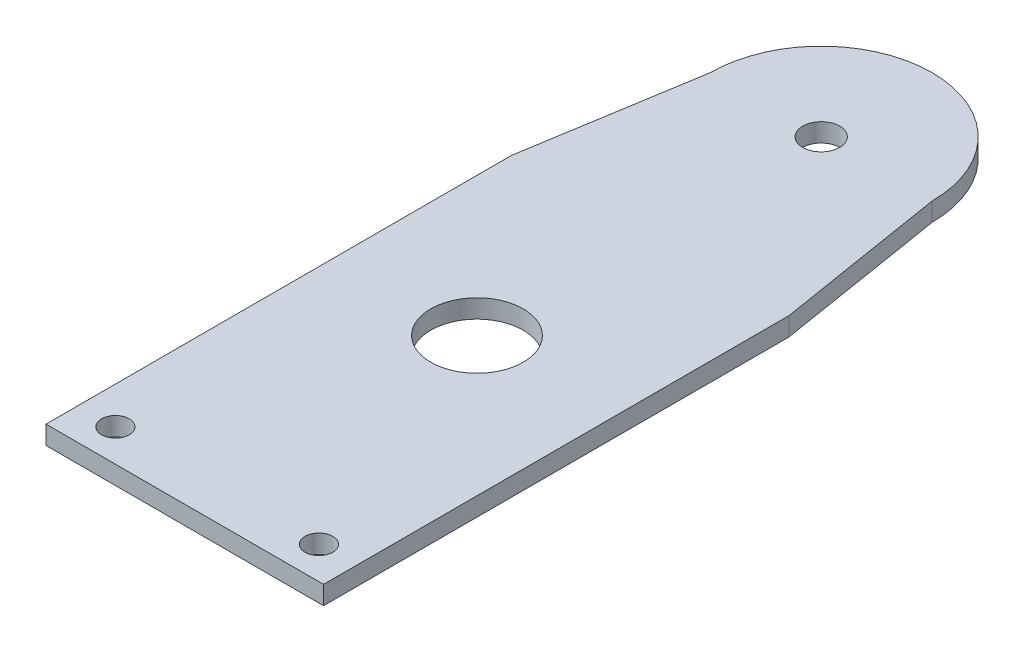
ISO-10303-21;
HEADER;
FILE_DESCRIPTION(('STEP AP214'),'2;1');
FILE_NAME('part.step','',(''),(''),'','','');
FILE_SCHEMA(('AUTOMOTIVE_DESIGN { 1 0 10303 214 1 1 1 1 }'));
ENDSEC;
DATA;
#1=APPLICATION_CONTEXT('core data for automotive mechanical design processes');
#2=APPLICATION_PROTOCOL_DEFINITION('international standard','automotive_design',2000,#1);
#3=PRODUCT_CONTEXT('',#1,'mechanical');
#4=PRODUCT('Part','Part','',(#3));
#5=PRODUCT_RELATED_PRODUCT_CATEGORY('part','',(#4));
#6=PRODUCT_DEFINITION_FORMATION('','',#4);
#7=PRODUCT_DEFINITION_CONTEXT('part definition',#1,'design');
#8=PRODUCT_DEFINITION('design','',#6,#7);
#9=PRODUCT_DEFINITION_SHAPE('','',#8);
#10=(LENGTH_UNIT() NAMED_UNIT(*) SI_UNIT(.MILLI.,.METRE.));
#11=(NAMED_UNIT(*) PLANE_ANGLE_UNIT() SI_UNIT($,.RADIAN.));
#12=(NAMED_UNIT(*) SI_UNIT($,.STERADIAN.) SOLID_ANGLE_UNIT());
#13=UNCERTAINTY_MEASURE_WITH_UNIT(LENGTH_MEASURE(1.E-05),#10,'distance_accuracy_value','');
#14=(GEOMETRIC_REPRESENTATION_CONTEXT(3) GLOBAL_UNCERTAINTY_ASSIGNED_CONTEXT((#13)) GLOBAL_UNIT_ASSIGNED_CONTEXT((#10,
#11,#12)) REPRESENTATION_CONTEXT('',''));
#15=CARTESIAN_POINT('',(0.,0.,0.));
#16=DIRECTION('',(0.,0.,1.));
#17=DIRECTION('',(1.,0.,0.));
#18=AXIS2_PLACEMENT_3D('',#15,#16,#17);
#19=CARTESIAN_POINT('',(-2.62522791540278,2.,-39.1827211912994));
#20=DIRECTION('',(0.,1.,0.));
#21=DIRECTION('',(0.,0.,1.));
#22=AXIS2_PLACEMENT_3D('',#19,#20,#21);
#23=PLANE('',#22);
#24=CARTESIAN_POINT('',(-2.62522791540278,2.,-39.1827211912994));
#25=DIRECTION('',(0.,1.,0.));
#26=DIRECTION('',(0.,0.,1.));
#27=AXIS2_PLACEMENT_3D('',#24,#25,#26);
#28=CIRCLE('',#27,2.);
#29=CARTESIAN_POINT('',(-2.62522791540278,2.,-37.1827211912994));
#30=VERTEX_POINT('',#29);
#31=EDGE_CURVE('E190',#30,#30,#28,.T.);
#32=ORIENTED_EDGE('',*,*,#31,.F.);
#33=EDGE_LOOP('',(#32));
#34=FACE_BOUND('',#33,.T.);
#35=CARTESIAN_POINT('',(-13.6252279154028,2.,26.1172788087006));
#36=DIRECTION('',(0.,1.,0.));
#37=DIRECTION('',(0.,0.,1.));
#38=AXIS2_PLACEMENT_3D('',#35,#36,#37);
#39=CIRCLE('',#38,1.5);
#40=CARTESIAN_POINT('',(-13.6252279154028,2.,27.6172788087006));
#41=VERTEX_POINT('',#40);
#42=EDGE_CURVE('E123',#41,#41,#39,.T.);
#43=ORIENTED_EDGE('',*,*,#42,.F.);
#44=EDGE_LOOP('',(#43));
#45=FACE_BOUND('',#44,.T.);
#46=DIRECTION('',(0.,0.,1.));
#47=VECTOR('',#46,1.);
#48=CARTESIAN_POINT('',(-17.6252279154028,2.,29.6172788087006));
#49=LINE('',#48,#47);
#50=CARTESIAN_POINT('',(-17.6252279154028,2.,-20.6827211912994));
#51=VERTEX_POINT('',#50);
#52=CARTESIAN_POINT('',(-17.6252279154028,2.,29.6172788087006));
#53=VERTEX_POINT('',#52);
#54=EDGE_CURVE('E130',#51,#53,#49,.T.);
#55=ORIENTED_EDGE('',*,*,#54,.T.);
#56=DIRECTION('',(1.,0.,0.));
#57=VECTOR('',#56,1.);
#58=CARTESIAN_POINT('',(-10.6252279154028,2.,29.6172788087006));
#59=LINE('',#58,#57);
#60=CARTESIAN_POINT('',(12.3747720845972,2.,29.6172788087006));
#61=VERTEX_POINT('',#60);
#62=EDGE_CURVE('E88',#53,#61,#59,.T.);
#63=ORIENTED_EDGE('',*,*,#62,.T.);
#64=DIRECTION('',(0.,0.,-1.));
#65=VECTOR('',#64,1.);
#66=CARTESIAN_POINT('',(12.3747720845972,2.,29.6172788087006));
#67=LINE('',#66,#65);
#68=CARTESIAN_POINT('',(12.3747720845972,2.,-20.6827211912994));
#69=VERTEX_POINT('',#68);
#70=EDGE_CURVE('E101',#61,#69,#67,.T.);
#71=ORIENTED_EDGE('',*,*,#70,.T.);
#72=DIRECTION('',(-0.160071158553662,0.,-0.987105477747585));
#73=VECTOR('',#72,1.);
#74=CARTESIAN_POINT('',(12.3747720845972,2.,-20.6827211912994));
#75=LINE('',#74,#73);
#76=CARTESIAN_POINT('',(9.37477208459723,2.,-39.1827211912994));
#77=VERTEX_POINT('',#76);
#78=EDGE_CURVE('E95',#69,#77,#75,.T.);
#79=ORIENTED_EDGE('',*,*,#78,.T.);
#80=CARTESIAN_POINT('',(-2.62522791540278,2.,-39.1827211912994));
#81=DIRECTION('',(0.,1.,0.));
#82=DIRECTION('',(0.,0.,1.));
#83=AXIS2_PLACEMENT_3D('',#80,#81,#82);
#84=CIRCLE('',#83,12.);
#85=CARTESIAN_POINT('',(-14.6252279154028,2.,-39.1827211912994));
#86=VERTEX_POINT('',#85);
#87=EDGE_CURVE('E99',#77,#86,#84,.T.);
#88=ORIENTED_EDGE('',*,*,#87,.T.);
#89=DIRECTION('',(-0.160071158553662,0.,0.987105477747585));
#90=VECTOR('',#89,1.);
#91=CARTESIAN_POINT('',(-17.6252279154028,2.,-20.6827211912994));
#92=LINE('',#91,#90);
#93=EDGE_CURVE('E51',#86,#51,#92,.T.);
#94=ORIENTED_EDGE('',*,*,#93,.T.);
#95=EDGE_LOOP('',(#55,#63,#71,#79,#88,#94));
#96=FACE_BOUND('',#95,.T.);
#97=CARTESIAN_POINT('',(8.37477208459722,2.,26.1172788087006));
#98=DIRECTION('',(0.,1.,0.));
#99=DIRECTION('',(0.,0.,1.));
#100=AXIS2_PLACEMENT_3D('',#97,#98,#99);
#101=CIRCLE('',#100,1.5);
#102=CARTESIAN_POINT('',(8.37477208459722,2.,27.6172788087006));
#103=VERTEX_POINT('',#102);
#104=EDGE_CURVE('E196',#103,#103,#101,.T.);
#105=ORIENTED_EDGE('',*,*,#104,.F.);
#106=EDGE_LOOP('',(#105));
#107=FACE_BOUND('',#106,.T.);
#108=CARTESIAN_POINT('',(-2.62522791540278,2.,-1.97272119129942));
#109=DIRECTION('',(0.,1.,0.));
#110=DIRECTION('',(0.,0.,1.));
#111=AXIS2_PLACEMENT_3D('',#108,#109,#110);
#112=CIRCLE('',#111,5.);
#113=CARTESIAN_POINT('',(-2.62522791540278,2.,3.02727880870058));
#114=VERTEX_POINT('',#113);
#115=EDGE_CURVE('E181',#114,#114,#112,.T.);
#116=ORIENTED_EDGE('',*,*,#115,.F.);
#117=EDGE_LOOP('',(#116));
#118=FACE_BOUND('',#117,.T.);
#119=ADVANCED_FACE('F34',(#34,#45,#96,#107,#118),#23,.T.);
#120=CARTESIAN_POINT('',(-2.62522791540278,0.,-39.1827211912994));
#121=DIRECTION('',(0.,1.,0.));
#122=DIRECTION('',(0.,0.,1.));
#123=AXIS2_PLACEMENT_3D('',#120,#121,#122);
#124=PLANE('',#123);
#125=DIRECTION('',(0.,0.,1.));
#126=VECTOR('',#125,1.);
#127=CARTESIAN_POINT('',(-17.6252279154028,0.,29.6172788087006));
#128=LINE('',#127,#126);
#129=CARTESIAN_POINT('',(-17.6252279154028,0.,-20.6827211912994));
#130=VERTEX_POINT('',#129);
#131=CARTESIAN_POINT('',(-17.6252279154028,0.,29.6172788087006));
#132=VERTEX_POINT('',#131);
#133=EDGE_CURVE('E119',#130,#132,#128,.T.);
#134=ORIENTED_EDGE('',*,*,#133,.F.);
#135=DIRECTION('',(-0.160071158553662,0.,0.987105477747585));
#136=VECTOR('',#135,1.);
#137=CARTESIAN_POINT('',(-17.6252279154028,0.,-20.6827211912994));
#138=LINE('',#137,#136);
#139=CARTESIAN_POINT('',(-14.6252279154028,0.,-39.1827211912994));
#140=VERTEX_POINT('',#139);
#141=EDGE_CURVE('E80',#140,#130,#138,.T.);
#142=ORIENTED_EDGE('',*,*,#141,.F.);
#143=CARTESIAN_POINT('',(-2.62522791540278,0.,-39.1827211912994));
#144=DIRECTION('',(0.,1.,0.));
#145=DIRECTION('',(0.,0.,1.));
#146=AXIS2_PLACEMENT_3D('',#143,#144,#145);
#147=CIRCLE('',#146,12.);
#148=CARTESIAN_POINT('',(9.37477208459723,0.,-39.1827211912994));
#149=VERTEX_POINT('',#148);
#150=EDGE_CURVE('E74',#149,#140,#147,.T.);
#151=ORIENTED_EDGE('',*,*,#150,.F.);
#152=DIRECTION('',(-0.160071158553662,0.,-0.987105477747585));
#153=VECTOR('',#152,1.);
#154=CARTESIAN_POINT('',(12.3747720845972,0.,-20.6827211912994));
#155=LINE('',#154,#153);
#156=CARTESIAN_POINT('',(12.3747720845972,0.,-20.6827211912994));
#157=VERTEX_POINT('',#156);
#158=EDGE_CURVE('E109',#157,#149,#155,.T.);
#159=ORIENTED_EDGE('',*,*,#158,.F.);
#160=DIRECTION('',(0.,0.,-1.));
#161=VECTOR('',#160,1.);
#162=CARTESIAN_POINT('',(12.3747720845972,0.,29.6172788087006));
#163=LINE('',#162,#161);
#164=CARTESIAN_POINT('',(12.3747720845972,0.,29.6172788087006));
#165=VERTEX_POINT('',#164);
#166=EDGE_CURVE('E125',#165,#157,#163,.T.);
#167=ORIENTED_EDGE('',*,*,#166,.F.);
#168=DIRECTION('',(1.,0.,0.));
#169=VECTOR('',#168,1.);
#170=CARTESIAN_POINT('',(5.37477208459723,0.,29.6172788087006));
#171=LINE('',#170,#169);
#172=EDGE_CURVE('E122',#132,#165,#171,.T.);
#173=ORIENTED_EDGE('',*,*,#172,.F.);
#174=EDGE_LOOP('',(#134,#142,#151,#159,#167,#173));
#175=FACE_BOUND('',#174,.T.);
#176=CARTESIAN_POINT('',(-13.6252279154028,0.,26.1172788087006));
#177=DIRECTION('',(0.,1.,0.));
#178=DIRECTION('',(0.,0.,1.));
#179=AXIS2_PLACEMENT_3D('',#176,#177,#178);
#180=CIRCLE('',#179,1.5);
#181=CARTESIAN_POINT('',(-13.6252279154028,0.,27.6172788087006));
#182=VERTEX_POINT('',#181);
#183=EDGE_CURVE('E199',#182,#182,#180,.T.);
#184=ORIENTED_EDGE('',*,*,#183,.T.);
#185=EDGE_LOOP('',(#184));
#186=FACE_BOUND('',#185,.T.);
#187=CARTESIAN_POINT('',(8.37477208459722,0.,26.1172788087006));
#188=DIRECTION('',(0.,1.,0.));
#189=DIRECTION('',(0.,0.,1.));
#190=AXIS2_PLACEMENT_3D('',#187,#188,#189);
#191=CIRCLE('',#190,1.5);
#192=CARTESIAN_POINT('',(8.37477208459722,0.,27.6172788087006));
#193=VERTEX_POINT('',#192);
#194=EDGE_CURVE('E193',#193,#193,#191,.T.);
#195=ORIENTED_EDGE('',*,*,#194,.T.);
#196=EDGE_LOOP('',(#195));
#197=FACE_BOUND('',#196,.T.);
#198=CARTESIAN_POINT('',(-2.62522791540278,0.,-39.1827211912994));
#199=DIRECTION('',(0.,1.,0.));
#200=DIRECTION('',(0.,0.,1.));
#201=AXIS2_PLACEMENT_3D('',#198,#199,#200);
#202=CIRCLE('',#201,2.);
#203=CARTESIAN_POINT('',(-2.62522791540278,0.,-37.1827211912994));
#204=VERTEX_POINT('',#203);
#205=EDGE_CURVE('E187',#204,#204,#202,.T.);
#206=ORIENTED_EDGE('',*,*,#205,.T.);
#207=EDGE_LOOP('',(#206));
#208=FACE_BOUND('',#207,.T.);
#209=CARTESIAN_POINT('',(-2.62522791540278,0.,-1.97272119129942));
#210=DIRECTION('',(0.,1.,0.));
#211=DIRECTION('',(0.,0.,1.));
#212=AXIS2_PLACEMENT_3D('',#209,#210,#211);
#213=CIRCLE('',#212,5.);
#214=CARTESIAN_POINT('',(-2.62522791540278,0.,3.02727880870058));
#215=VERTEX_POINT('',#214);
#216=EDGE_CURVE('E184',#215,#215,#213,.T.);
#217=ORIENTED_EDGE('',*,*,#216,.T.);
#218=EDGE_LOOP('',(#217));
#219=FACE_BOUND('',#218,.T.);
#220=ADVANCED_FACE('F139',(#175,#186,#197,#208,#219),#124,.F.);
#221=CARTESIAN_POINT('',(-17.6252279154028,2.,29.6172788087006));
#222=DIRECTION('',(1.,0.,0.));
#223=DIRECTION('',(0.,0.,-1.));
#224=AXIS2_PLACEMENT_3D('',#221,#222,#223);
#225=PLANE('',#224);
#226=ORIENTED_EDGE('',*,*,#133,.T.);
#227=DIRECTION('',(0.,-1.,0.));
#228=VECTOR('',#227,1.);
#229=CARTESIAN_POINT('',(-17.6252279154028,2.,29.6172788087006));
#230=LINE('',#229,#228);
#231=EDGE_CURVE('E11',#53,#132,#230,.T.);
#232=ORIENTED_EDGE('',*,*,#231,.F.);
#233=ORIENTED_EDGE('',*,*,#54,.F.);
#234=DIRECTION('',(0.,-1.,0.));
#235=VECTOR('',#234,1.);
#236=CARTESIAN_POINT('',(-17.6252279154028,2.,-20.6827211912994));
#237=LINE('',#236,#235);
#238=EDGE_CURVE('E115',#51,#130,#237,.T.);
#239=ORIENTED_EDGE('',*,*,#238,.T.);
#240=EDGE_LOOP('',(#226,#232,#233,#239));
#241=FACE_BOUND('',#240,.T.);
#242=ADVANCED_FACE('F36',(#241),#225,.F.);
#243=CARTESIAN_POINT('',(5.37477208459723,2.,29.6172788087006));
#244=DIRECTION('',(0.,0.,-1.));
#245=DIRECTION('',(-1.,0.,0.));
#246=AXIS2_PLACEMENT_3D('',#243,#244,#245);
#247=PLANE('',#246);
#248=ORIENTED_EDGE('',*,*,#172,.T.);
#249=DIRECTION('',(0.,-1.,0.));
#250=VECTOR('',#249,1.);
#251=CARTESIAN_POINT('',(12.3747720845972,2.,29.6172788087006));
#252=LINE('',#251,#250);
#253=EDGE_CURVE('E43',#61,#165,#252,.T.);
#254=ORIENTED_EDGE('',*,*,#253,.F.);
#255=ORIENTED_EDGE('',*,*,#62,.F.);
#256=ORIENTED_EDGE('',*,*,#231,.T.);
#257=EDGE_LOOP('',(#248,#254,#255,#256));
#258=FACE_BOUND('',#257,.T.);
#259=ADVANCED_FACE('F257',(#258),#247,.F.);
#260=CARTESIAN_POINT('',(12.3747720845972,2.,29.6172788087006));
#261=DIRECTION('',(-1.,0.,0.));
#262=DIRECTION('',(0.,0.,1.));
#263=AXIS2_PLACEMENT_3D('',#260,#261,#262);
#264=PLANE('',#263);
#265=ORIENTED_EDGE('',*,*,#166,.T.);
#266=DIRECTION('',(0.,-1.,0.));
#267=VECTOR('',#266,1.);
#268=CARTESIAN_POINT('',(12.3747720845972,2.,-20.6827211912994));
#269=LINE('',#268,#267);
#270=EDGE_CURVE('E110',#69,#157,#269,.T.);
#271=ORIENTED_EDGE('',*,*,#270,.F.);
#272=ORIENTED_EDGE('',*,*,#70,.F.);
#273=ORIENTED_EDGE('',*,*,#253,.T.);
#274=EDGE_LOOP('',(#265,#271,#272,#273));
#275=FACE_BOUND('',#274,.T.);
#276=ADVANCED_FACE('F136',(#275),#264,.F.);
#277=CARTESIAN_POINT('',(12.3747720845972,2.,-20.6827211912994));
#278=DIRECTION('',(-0.987105477747585,0.,0.160071158553662));
#279=DIRECTION('',(0.160071158553662,0.,0.987105477747585));
#280=AXIS2_PLACEMENT_3D('',#277,#278,#279);
#281=PLANE('',#280);
#282=ORIENTED_EDGE('',*,*,#158,.T.);
#283=DIRECTION('',(0.,-1.,0.));
#284=VECTOR('',#283,1.);
#285=CARTESIAN_POINT('',(9.37477208459723,2.,-39.1827211912994));
#286=LINE('',#285,#284);
#287=EDGE_CURVE('E106',#77,#149,#286,.T.);
#288=ORIENTED_EDGE('',*,*,#287,.F.);
#289=ORIENTED_EDGE('',*,*,#78,.F.);
#290=ORIENTED_EDGE('',*,*,#270,.T.);
#291=EDGE_LOOP('',(#282,#288,#289,#290));
#292=FACE_BOUND('',#291,.T.);
#293=ADVANCED_FACE('F107',(#292),#281,.F.);
#294=CARTESIAN_POINT('',(-2.62522791540278,2.,-39.1827211912994));
#295=DIRECTION('',(0.,-1.,0.));
#296=DIRECTION('',(0.,0.,-1.));
#297=AXIS2_PLACEMENT_3D('',#294,#295,#296);
#298=CYLINDRICAL_SURFACE('',#297,12.);
#299=ORIENTED_EDGE('',*,*,#150,.T.);
#300=DIRECTION('',(0.,-1.,0.));
#301=VECTOR('',#300,1.);
#302=CARTESIAN_POINT('',(-14.6252279154028,2.,-39.1827211912994));
#303=LINE('',#302,#301);
#304=EDGE_CURVE('E111',#86,#140,#303,.T.);
#305=ORIENTED_EDGE('',*,*,#304,.F.);
#306=ORIENTED_EDGE('',*,*,#87,.F.);
#307=ORIENTED_EDGE('',*,*,#287,.T.);
#308=EDGE_LOOP('',(#299,#305,#306,#307));
#309=FACE_BOUND('',#308,.T.);
#310=ADVANCED_FACE('F113',(#309),#298,.T.);
#311=CARTESIAN_POINT('',(-17.6252279154028,2.,-20.6827211912994));
#312=DIRECTION('',(0.987105477747585,0.,0.160071158553662));
#313=DIRECTION('',(0.160071158553662,0.,-0.987105477747585));
#314=AXIS2_PLACEMENT_3D('',#311,#312,#313);
#315=PLANE('',#314);
#316=ORIENTED_EDGE('',*,*,#141,.T.);
#317=ORIENTED_EDGE('',*,*,#238,.F.);
#318=ORIENTED_EDGE('',*,*,#93,.F.);
#319=ORIENTED_EDGE('',*,*,#304,.T.);
#320=EDGE_LOOP('',(#316,#317,#318,#319));
#321=FACE_BOUND('',#320,.T.);
#322=ADVANCED_FACE('F144',(#321),#315,.F.);
#323=CARTESIAN_POINT('',(-13.6252279154028,2.,26.1172788087006));
#324=DIRECTION('',(0.,-1.,0.));
#325=DIRECTION('',(0.,0.,-1.));
#326=AXIS2_PLACEMENT_3D('',#323,#324,#325);
#327=CYLINDRICAL_SURFACE('',#326,1.5);
#328=ORIENTED_EDGE('',*,*,#42,.T.);
#329=EDGE_LOOP('',(#328));
#330=FACE_BOUND('',#329,.T.);
#331=ORIENTED_EDGE('',*,*,#183,.F.);
#332=EDGE_LOOP('',(#331));
#333=FACE_BOUND('',#332,.T.);
#334=ADVANCED_FACE('F146',(#330,#333),#327,.F.);
#335=CARTESIAN_POINT('',(8.37477208459722,2.,26.1172788087006));
#336=DIRECTION('',(0.,-1.,0.));
#337=DIRECTION('',(0.,0.,-1.));
#338=AXIS2_PLACEMENT_3D('',#335,#336,#337);
#339=CYLINDRICAL_SURFACE('',#338,1.5);
#340=ORIENTED_EDGE('',*,*,#104,.T.);
#341=EDGE_LOOP('',(#340));
#342=FACE_BOUND('',#341,.T.);
#343=ORIENTED_EDGE('',*,*,#194,.F.);
#344=EDGE_LOOP('',(#343));
#345=FACE_BOUND('',#344,.T.);
#346=ADVANCED_FACE('F152',(#342,#345),#339,.F.);
#347=CARTESIAN_POINT('',(-2.62522791540278,2.,-39.1827211912994));
#348=DIRECTION('',(0.,-1.,0.));
#349=DIRECTION('',(0.,0.,-1.));
#350=AXIS2_PLACEMENT_3D('',#347,#348,#349);
#351=CYLINDRICAL_SURFACE('',#350,2.);
#352=ORIENTED_EDGE('',*,*,#31,.T.);
#353=EDGE_LOOP('',(#352));
#354=FACE_BOUND('',#353,.T.);
#355=ORIENTED_EDGE('',*,*,#205,.F.);
#356=EDGE_LOOP('',(#355));
#357=FACE_BOUND('',#356,.T.);
#358=ADVANCED_FACE('F168',(#354,#357),#351,.F.);
#359=CARTESIAN_POINT('',(-2.62522791540278,2.,-1.97272119129942));
#360=DIRECTION('',(0.,-1.,0.));
#361=DIRECTION('',(0.,0.,-1.));
#362=AXIS2_PLACEMENT_3D('',#359,#360,#361);
#363=CYLINDRICAL_SURFACE('',#362,5.);
#364=ORIENTED_EDGE('',*,*,#115,.T.);
#365=EDGE_LOOP('',(#364));
#366=FACE_BOUND('',#365,.T.);
#367=ORIENTED_EDGE('',*,*,#216,.F.);
#368=EDGE_LOOP('',(#367));
#369=FACE_BOUND('',#368,.T.);
#370=ADVANCED_FACE('F172',(#366,#369),#363,.F.);
#371=CLOSED_SHELL('',(#119,#220,#242,#259,#276,#293,#310,#322,#334,#346,#358,#370));
#372=MANIFOLD_SOLID_BREP('B2',#371);
#373=ADVANCED_BREP_SHAPE_REPRESENTATION('',(#18,#372),#14);
#374=SHAPE_DEFINITION_REPRESENTATION(#9,#373);
ENDSEC;
END-ISO-10303-21;
